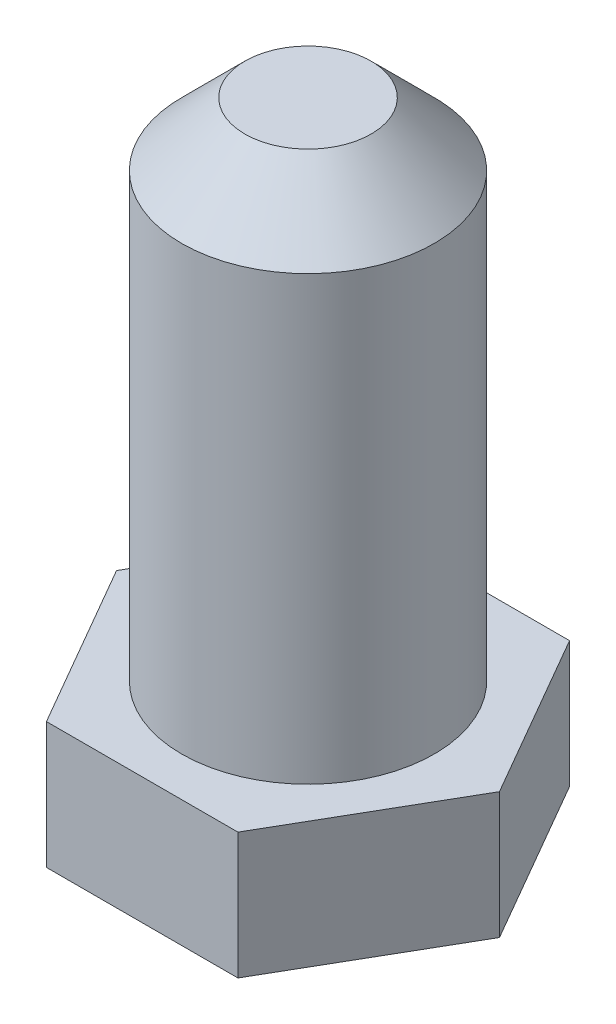
ISO-10303-21;
HEADER;
FILE_DESCRIPTION(('STEP AP214'),'2;1');
FILE_NAME('part.step','',(''),(''),'','','');
FILE_SCHEMA(('AUTOMOTIVE_DESIGN { 1 0 10303 214 1 1 1 1 }'));
ENDSEC;
DATA;
#1=APPLICATION_CONTEXT('core data for automotive mechanical design processes');
#2=APPLICATION_PROTOCOL_DEFINITION('international standard','automotive_design',2000,#1);
#3=PRODUCT_CONTEXT('',#1,'mechanical');
#4=PRODUCT('Part','Part','',(#3));
#5=PRODUCT_RELATED_PRODUCT_CATEGORY('part','',(#4));
#6=PRODUCT_DEFINITION_FORMATION('','',#4);
#7=PRODUCT_DEFINITION_CONTEXT('part definition',#1,'design');
#8=PRODUCT_DEFINITION('design','',#6,#7);
#9=PRODUCT_DEFINITION_SHAPE('','',#8);
#10=(LENGTH_UNIT() NAMED_UNIT(*) SI_UNIT(.MILLI.,.METRE.));
#11=(NAMED_UNIT(*) PLANE_ANGLE_UNIT() SI_UNIT($,.RADIAN.));
#12=(NAMED_UNIT(*) SI_UNIT($,.STERADIAN.) SOLID_ANGLE_UNIT());
#13=UNCERTAINTY_MEASURE_WITH_UNIT(LENGTH_MEASURE(1.E-05),#10,'distance_accuracy_value','');
#14=(GEOMETRIC_REPRESENTATION_CONTEXT(3) GLOBAL_UNCERTAINTY_ASSIGNED_CONTEXT((#13)) GLOBAL_UNIT_ASSIGNED_CONTEXT((#10,
#11,#12)) REPRESENTATION_CONTEXT('',''));
#15=CARTESIAN_POINT('',(0.,0.,0.));
#16=DIRECTION('',(0.,0.,1.));
#17=DIRECTION('',(1.,0.,0.));
#18=AXIS2_PLACEMENT_3D('',#15,#16,#17);
#19=CARTESIAN_POINT('',(9.62370729955479,12.7,16.6687499999999));
#20=DIRECTION('',(-0.866025403784442,0.,-0.499999999999995));
#21=DIRECTION('',(-0.499999999999995,0.,0.866025403784442));
#22=AXIS2_PLACEMENT_3D('',#19,#20,#21);
#23=PLANE('',#22);
#24=DIRECTION('',(0.499999999999995,0.,-0.866025403784442));
#25=VECTOR('',#24,1.);
#26=CARTESIAN_POINT('',(9.62370729955479,0.,16.6687499999999));
#27=LINE('',#26,#25);
#28=CARTESIAN_POINT('',(9.62370729955479,0.,16.6687499999999));
#29=VERTEX_POINT('',#28);
#30=CARTESIAN_POINT('',(19.2474145991092,0.,0.));
#31=VERTEX_POINT('',#30);
#32=EDGE_CURVE('E119',#29,#31,#27,.T.);
#33=ORIENTED_EDGE('',*,*,#32,.T.);
#34=DIRECTION('',(0.,-1.,0.));
#35=VECTOR('',#34,1.);
#36=CARTESIAN_POINT('',(19.2474145991092,12.7,0.));
#37=LINE('',#36,#35);
#38=CARTESIAN_POINT('',(19.2474145991092,12.7,0.));
#39=VERTEX_POINT('',#38);
#40=EDGE_CURVE('E136',#39,#31,#37,.T.);
#41=ORIENTED_EDGE('',*,*,#40,.F.);
#42=DIRECTION('',(0.499999999999995,0.,-0.866025403784442));
#43=VECTOR('',#42,1.);
#44=CARTESIAN_POINT('',(9.62370729955479,12.7,16.6687499999999));
#45=LINE('',#44,#43);
#46=CARTESIAN_POINT('',(9.62370729955479,12.7,16.6687499999999));
#47=VERTEX_POINT('',#46);
#48=EDGE_CURVE('E129',#47,#39,#45,.T.);
#49=ORIENTED_EDGE('',*,*,#48,.F.);
#50=DIRECTION('',(0.,-1.,0.));
#51=VECTOR('',#50,1.);
#52=CARTESIAN_POINT('',(9.62370729955479,12.7,16.6687499999999));
#53=LINE('',#52,#51);
#54=EDGE_CURVE('E115',#47,#29,#53,.T.);
#55=ORIENTED_EDGE('',*,*,#54,.T.);
#56=EDGE_LOOP('',(#33,#41,#49,#55));
#57=FACE_BOUND('',#56,.T.);
#58=ADVANCED_FACE('F33',(#57),#23,.F.);
#59=CARTESIAN_POINT('',(19.2474145991092,12.7,0.));
#60=DIRECTION('',(-0.866025403784438,0.,0.500000000000001));
#61=DIRECTION('',(0.500000000000001,0.,0.866025403784438));
#62=AXIS2_PLACEMENT_3D('',#59,#60,#61);
#63=PLANE('',#62);
#64=DIRECTION('',(-0.500000000000001,0.,-0.866025403784438));
#65=VECTOR('',#64,1.);
#66=CARTESIAN_POINT('',(19.2474145991092,0.,0.));
#67=LINE('',#66,#65);
#68=CARTESIAN_POINT('',(9.62370729955456,0.,-16.6687500000001));
#69=VERTEX_POINT('',#68);
#70=EDGE_CURVE('E122',#31,#69,#67,.T.);
#71=ORIENTED_EDGE('',*,*,#70,.T.);
#72=DIRECTION('',(0.,-1.,0.));
#73=VECTOR('',#72,1.);
#74=CARTESIAN_POINT('',(9.62370729955456,12.7,-16.6687500000001));
#75=LINE('',#74,#73);
#76=CARTESIAN_POINT('',(9.62370729955456,12.7,-16.6687500000001));
#77=VERTEX_POINT('',#76);
#78=EDGE_CURVE('E133',#77,#69,#75,.T.);
#79=ORIENTED_EDGE('',*,*,#78,.F.);
#80=DIRECTION('',(-0.500000000000001,0.,-0.866025403784438));
#81=VECTOR('',#80,1.);
#82=CARTESIAN_POINT('',(19.2474145991092,12.7,0.));
#83=LINE('',#82,#81);
#84=EDGE_CURVE('E88',#39,#77,#83,.T.);
#85=ORIENTED_EDGE('',*,*,#84,.F.);
#86=ORIENTED_EDGE('',*,*,#40,.T.);
#87=EDGE_LOOP('',(#71,#79,#85,#86));
#88=FACE_BOUND('',#87,.T.);
#89=ADVANCED_FACE('F149',(#88),#63,.F.);
#90=CARTESIAN_POINT('',(9.62370729955456,12.7,-16.6687500000001));
#91=DIRECTION('',(0.,0.,1.));
#92=DIRECTION('',(1.,0.,0.));
#93=AXIS2_PLACEMENT_3D('',#90,#91,#92);
#94=PLANE('',#93);
#95=DIRECTION('',(-1.,0.,0.));
#96=VECTOR('',#95,1.);
#97=CARTESIAN_POINT('',(9.62370729955456,0.,-16.6687500000001));
#98=LINE('',#97,#96);
#99=CARTESIAN_POINT('',(-9.62370729955468,0.,-16.66875));
#100=VERTEX_POINT('',#99);
#101=EDGE_CURVE('E124',#69,#100,#98,.T.);
#102=ORIENTED_EDGE('',*,*,#101,.T.);
#103=DIRECTION('',(0.,-1.,0.));
#104=VECTOR('',#103,1.);
#105=CARTESIAN_POINT('',(-9.62370729955468,12.7,-16.66875));
#106=LINE('',#105,#104);
#107=CARTESIAN_POINT('',(-9.62370729955468,12.7,-16.66875));
#108=VERTEX_POINT('',#107);
#109=EDGE_CURVE('E110',#108,#100,#106,.T.);
#110=ORIENTED_EDGE('',*,*,#109,.F.);
#111=DIRECTION('',(-1.,0.,0.));
#112=VECTOR('',#111,1.);
#113=CARTESIAN_POINT('',(9.62370729955456,12.7,-16.6687500000001));
#114=LINE('',#113,#112);
#115=EDGE_CURVE('E101',#77,#108,#114,.T.);
#116=ORIENTED_EDGE('',*,*,#115,.F.);
#117=ORIENTED_EDGE('',*,*,#78,.T.);
#118=EDGE_LOOP('',(#102,#110,#116,#117));
#119=FACE_BOUND('',#118,.T.);
#120=ADVANCED_FACE('F152',(#119),#94,.F.);
#121=CARTESIAN_POINT('',(-9.62370729955468,12.7,-16.66875));
#122=DIRECTION('',(0.866025403784442,0.,0.499999999999995));
#123=DIRECTION('',(0.499999999999995,0.,-0.866025403784442));
#124=AXIS2_PLACEMENT_3D('',#121,#122,#123);
#125=PLANE('',#124);
#126=DIRECTION('',(-0.499999999999995,0.,0.866025403784442));
#127=VECTOR('',#126,1.);
#128=CARTESIAN_POINT('',(-9.62370729955468,0.,-16.66875));
#129=LINE('',#128,#127);
#130=CARTESIAN_POINT('',(-19.2474145991092,0.,1.34403977787533E-13));
#131=VERTEX_POINT('',#130);
#132=EDGE_CURVE('E109',#100,#131,#129,.T.);
#133=ORIENTED_EDGE('',*,*,#132,.T.);
#134=DIRECTION('',(0.,-1.,0.));
#135=VECTOR('',#134,1.);
#136=CARTESIAN_POINT('',(-19.2474145991092,12.7,1.34403977787533E-13));
#137=LINE('',#136,#135);
#138=CARTESIAN_POINT('',(-19.2474145991092,12.7,1.34403977787533E-13));
#139=VERTEX_POINT('',#138);
#140=EDGE_CURVE('E106',#139,#131,#137,.T.);
#141=ORIENTED_EDGE('',*,*,#140,.F.);
#142=DIRECTION('',(-0.499999999999995,0.,0.866025403784442));
#143=VECTOR('',#142,1.);
#144=CARTESIAN_POINT('',(-9.62370729955468,12.7,-16.66875));
#145=LINE('',#144,#143);
#146=EDGE_CURVE('E95',#108,#139,#145,.T.);
#147=ORIENTED_EDGE('',*,*,#146,.F.);
#148=ORIENTED_EDGE('',*,*,#109,.T.);
#149=EDGE_LOOP('',(#133,#141,#147,#148));
#150=FACE_BOUND('',#149,.T.);
#151=ADVANCED_FACE('F107',(#150),#125,.F.);
#152=CARTESIAN_POINT('',(-19.2474145991092,12.7,1.34403977787533E-13));
#153=DIRECTION('',(0.866025403784434,0.,-0.500000000000007));
#154=DIRECTION('',(-0.500000000000007,0.,-0.866025403784435));
#155=AXIS2_PLACEMENT_3D('',#152,#153,#154);
#156=PLANE('',#155);
#157=DIRECTION('',(0.500000000000007,0.,0.866025403784435));
#158=VECTOR('',#157,1.);
#159=CARTESIAN_POINT('',(-19.2474145991092,0.,1.34403977787533E-13));
#160=LINE('',#159,#158);
#161=CARTESIAN_POINT('',(-9.62370729955445,0.,16.6687500000001));
#162=VERTEX_POINT('',#161);
#163=EDGE_CURVE('E73',#131,#162,#160,.T.);
#164=ORIENTED_EDGE('',*,*,#163,.T.);
#165=DIRECTION('',(0.,-1.,0.));
#166=VECTOR('',#165,1.);
#167=CARTESIAN_POINT('',(-9.62370729955445,12.7,16.6687500000001));
#168=LINE('',#167,#166);
#169=CARTESIAN_POINT('',(-9.62370729955445,12.7,16.6687500000001));
#170=VERTEX_POINT('',#169);
#171=EDGE_CURVE('E111',#170,#162,#168,.T.);
#172=ORIENTED_EDGE('',*,*,#171,.F.);
#173=DIRECTION('',(0.500000000000007,0.,0.866025403784435));
#174=VECTOR('',#173,1.);
#175=CARTESIAN_POINT('',(-19.2474145991092,12.7,1.34403977787533E-13));
#176=LINE('',#175,#174);
#177=EDGE_CURVE('E99',#139,#170,#176,.T.);
#178=ORIENTED_EDGE('',*,*,#177,.F.);
#179=ORIENTED_EDGE('',*,*,#140,.T.);
#180=EDGE_LOOP('',(#164,#172,#178,#179));
#181=FACE_BOUND('',#180,.T.);
#182=ADVANCED_FACE('F113',(#181),#156,.F.);
#183=CARTESIAN_POINT('',(-9.62370729955445,12.7,16.6687500000001));
#184=DIRECTION('',(0.,0.,-1.));
#185=DIRECTION('',(-1.,0.,0.));
#186=AXIS2_PLACEMENT_3D('',#183,#184,#185);
#187=PLANE('',#186);
#188=DIRECTION('',(1.,0.,0.));
#189=VECTOR('',#188,1.);
#190=CARTESIAN_POINT('',(-9.62370729955445,0.,16.6687500000001));
#191=LINE('',#190,#189);
#192=EDGE_CURVE('E79',#162,#29,#191,.T.);
#193=ORIENTED_EDGE('',*,*,#192,.T.);
#194=ORIENTED_EDGE('',*,*,#54,.F.);
#195=DIRECTION('',(1.,0.,0.));
#196=VECTOR('',#195,1.);
#197=CARTESIAN_POINT('',(-9.62370729955445,12.7,16.6687500000001));
#198=LINE('',#197,#196);
#199=EDGE_CURVE('E50',#170,#47,#198,.T.);
#200=ORIENTED_EDGE('',*,*,#199,.F.);
#201=ORIENTED_EDGE('',*,*,#171,.T.);
#202=EDGE_LOOP('',(#193,#194,#200,#201));
#203=FACE_BOUND('',#202,.T.);
#204=ADVANCED_FACE('F157',(#203),#187,.F.);
#205=CARTESIAN_POINT('',(0.,12.7,0.));
#206=DIRECTION('',(0.,1.,0.));
#207=DIRECTION('',(0.,0.,1.));
#208=AXIS2_PLACEMENT_3D('',#205,#206,#207);
#209=PLANE('',#208);
#210=CARTESIAN_POINT('',(0.,12.7,0.));
#211=DIRECTION('',(0.,1.,0.));
#212=DIRECTION('',(0.,0.,1.));
#213=AXIS2_PLACEMENT_3D('',#210,#211,#212);
#214=CIRCLE('',#213,12.7);
#215=CARTESIAN_POINT('',(0.,12.7,12.7));
#216=VERTEX_POINT('',#215);
#217=EDGE_CURVE('E137',#216,#216,#214,.T.);
#218=ORIENTED_EDGE('',*,*,#217,.F.);
#219=EDGE_LOOP('',(#218));
#220=FACE_BOUND('',#219,.T.);
#221=ORIENTED_EDGE('',*,*,#48,.T.);
#222=ORIENTED_EDGE('',*,*,#84,.T.);
#223=ORIENTED_EDGE('',*,*,#115,.T.);
#224=ORIENTED_EDGE('',*,*,#146,.T.);
#225=ORIENTED_EDGE('',*,*,#177,.T.);
#226=ORIENTED_EDGE('',*,*,#199,.T.);
#227=EDGE_LOOP('',(#221,#222,#223,#224,#225,#226));
#228=FACE_BOUND('',#227,.T.);
#229=ADVANCED_FACE('F97',(#220,#228),#209,.T.);
#230=CARTESIAN_POINT('',(0.,0.,0.));
#231=DIRECTION('',(0.,1.,0.));
#232=DIRECTION('',(0.,0.,1.));
#233=AXIS2_PLACEMENT_3D('',#230,#231,#232);
#234=PLANE('',#233);
#235=ORIENTED_EDGE('',*,*,#32,.F.);
#236=ORIENTED_EDGE('',*,*,#192,.F.);
#237=ORIENTED_EDGE('',*,*,#163,.F.);
#238=ORIENTED_EDGE('',*,*,#132,.F.);
#239=ORIENTED_EDGE('',*,*,#101,.F.);
#240=ORIENTED_EDGE('',*,*,#70,.F.);
#241=EDGE_LOOP('',(#235,#236,#237,#238,#239,#240));
#242=FACE_BOUND('',#241,.T.);
#243=ADVANCED_FACE('F155',(#242),#234,.F.);
#244=CARTESIAN_POINT('',(0.,57.15,0.));
#245=DIRECTION('',(0.,-1.,0.));
#246=DIRECTION('',(0.,0.,-1.));
#247=AXIS2_PLACEMENT_3D('',#244,#245,#246);
#248=CYLINDRICAL_SURFACE('',#247,12.7);
#249=CARTESIAN_POINT('',(0.,57.15,0.));
#250=DIRECTION('',(0.,1.,0.));
#251=DIRECTION('',(0.,0.,1.));
#252=AXIS2_PLACEMENT_3D('',#249,#250,#251);
#253=CIRCLE('',#252,12.7);
#254=CARTESIAN_POINT('',(0.,57.15,12.7));
#255=VERTEX_POINT('',#254);
#256=EDGE_CURVE('E11',#255,#255,#253,.F.);
#257=ORIENTED_EDGE('',*,*,#256,.T.);
#258=EDGE_LOOP('',(#257));
#259=FACE_BOUND('',#258,.T.);
#260=ORIENTED_EDGE('',*,*,#217,.T.);
#261=EDGE_LOOP('',(#260));
#262=FACE_BOUND('',#261,.T.);
#263=ADVANCED_FACE('F199',(#259,#262),#248,.T.);
#264=CARTESIAN_POINT('',(0.,63.5,0.));
#265=DIRECTION('',(0.,1.,0.));
#266=DIRECTION('',(0.,0.,1.));
#267=AXIS2_PLACEMENT_3D('',#264,#265,#266);
#268=PLANE('',#267);
#269=CARTESIAN_POINT('',(0.,63.5,0.));
#270=DIRECTION('',(0.,1.,0.));
#271=DIRECTION('',(0.,0.,1.));
#272=AXIS2_PLACEMENT_3D('',#269,#270,#271);
#273=CIRCLE('',#272,6.35000000000002);
#274=CARTESIAN_POINT('',(0.,63.5,6.35000000000002));
#275=VERTEX_POINT('',#274);
#276=EDGE_CURVE('E42',#275,#275,#273,.T.);
#277=ORIENTED_EDGE('',*,*,#276,.T.);
#278=EDGE_LOOP('',(#277));
#279=FACE_BOUND('',#278,.T.);
#280=ADVANCED_FACE('F213',(#279),#268,.T.);
#281=CARTESIAN_POINT('',(0.,63.5,0.));
#282=DIRECTION('',(0.,-1.,0.));
#283=DIRECTION('',(0.,0.,-1.));
#284=AXIS2_PLACEMENT_3D('',#281,#282,#283);
#285=CONICAL_SURFACE('',#284,6.35000000000002,0.785398163397447);
#286=ORIENTED_EDGE('',*,*,#256,.F.);
#287=EDGE_LOOP('',(#286));
#288=FACE_BOUND('',#287,.T.);
#289=ORIENTED_EDGE('',*,*,#276,.F.);
#290=EDGE_LOOP('',(#289));
#291=FACE_BOUND('',#290,.T.);
#292=ADVANCED_FACE('F35',(#288,#291),#285,.T.);
#293=CLOSED_SHELL('',(#58,#89,#120,#151,#182,#204,#229,#243,#263,#280,#292));
#294=MANIFOLD_SOLID_BREP('B2',#293);
#295=ADVANCED_BREP_SHAPE_REPRESENTATION('',(#18,#294),#14);
#296=SHAPE_DEFINITION_REPRESENTATION(#9,#295);
ENDSEC;
END-ISO-10303-21;
